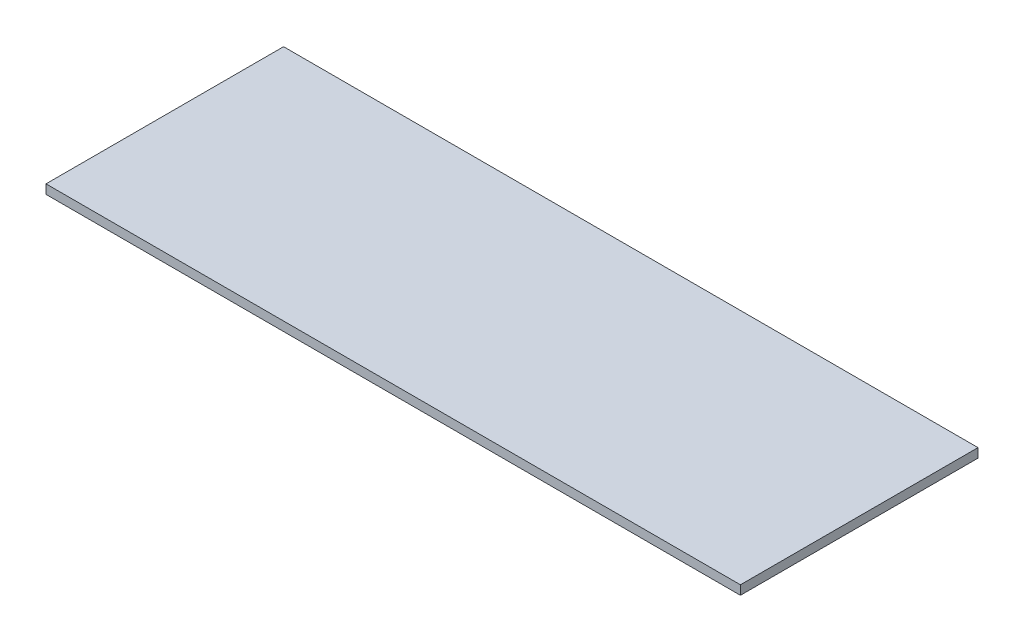
ISO-10303-21;
HEADER;
FILE_DESCRIPTION(('STEP AP214'),'2;1');
FILE_NAME('part.step','',(''),(''),'','','');
FILE_SCHEMA(('AUTOMOTIVE_DESIGN { 1 0 10303 214 1 1 1 1 }'));
ENDSEC;
DATA;
#1=APPLICATION_CONTEXT('core data for automotive mechanical design processes');
#2=APPLICATION_PROTOCOL_DEFINITION('international standard','automotive_design',2000,#1);
#3=PRODUCT_CONTEXT('',#1,'mechanical');
#4=PRODUCT('Part','Part','',(#3));
#5=PRODUCT_RELATED_PRODUCT_CATEGORY('part','',(#4));
#6=PRODUCT_DEFINITION_FORMATION('','',#4);
#7=PRODUCT_DEFINITION_CONTEXT('part definition',#1,'design');
#8=PRODUCT_DEFINITION('design','',#6,#7);
#9=PRODUCT_DEFINITION_SHAPE('','',#8);
#10=(LENGTH_UNIT() NAMED_UNIT(*) SI_UNIT(.MILLI.,.METRE.));
#11=(NAMED_UNIT(*) PLANE_ANGLE_UNIT() SI_UNIT($,.RADIAN.));
#12=(NAMED_UNIT(*) SI_UNIT($,.STERADIAN.) SOLID_ANGLE_UNIT());
#13=UNCERTAINTY_MEASURE_WITH_UNIT(LENGTH_MEASURE(1.E-05),#10,'distance_accuracy_value','');
#14=(GEOMETRIC_REPRESENTATION_CONTEXT(3) GLOBAL_UNCERTAINTY_ASSIGNED_CONTEXT((#13)) GLOBAL_UNIT_ASSIGNED_CONTEXT((#10,
#11,#12)) REPRESENTATION_CONTEXT('',''));
#15=CARTESIAN_POINT('',(0.,0.,0.));
#16=DIRECTION('',(0.,0.,1.));
#17=DIRECTION('',(1.,0.,0.));
#18=AXIS2_PLACEMENT_3D('',#15,#16,#17);
#19=CARTESIAN_POINT('',(-39.1198428290766,1.,-16.3497053045187));
#20=DIRECTION('',(1.,0.,0.));
#21=DIRECTION('',(0.,0.,-1.));
#22=AXIS2_PLACEMENT_3D('',#19,#20,#21);
#23=PLANE('',#22);
#24=DIRECTION('',(0.,0.,1.));
#25=VECTOR('',#24,1.);
#26=CARTESIAN_POINT('',(-39.1198428290766,0.,-16.3497053045187));
#27=LINE('',#26,#25);
#28=CARTESIAN_POINT('',(-39.1198428290766,0.,-16.3497053045187));
#29=VERTEX_POINT('',#28);
#30=CARTESIAN_POINT('',(-39.1198428290766,0.,9.65029469548134));
#31=VERTEX_POINT('',#30);
#32=EDGE_CURVE('E95',#29,#31,#27,.T.);
#33=ORIENTED_EDGE('',*,*,#32,.T.);
#34=DIRECTION('',(0.,-1.,0.));
#35=VECTOR('',#34,1.);
#36=CARTESIAN_POINT('',(-39.1198428290766,1.,9.65029469548134));
#37=LINE('',#36,#35);
#38=CARTESIAN_POINT('',(-39.1198428290766,1.,9.65029469548134));
#39=VERTEX_POINT('',#38);
#40=EDGE_CURVE('E11',#39,#31,#37,.T.);
#41=ORIENTED_EDGE('',*,*,#40,.F.);
#42=DIRECTION('',(0.,0.,1.));
#43=VECTOR('',#42,1.);
#44=CARTESIAN_POINT('',(-39.1198428290766,1.,-16.3497053045187));
#45=LINE('',#44,#43);
#46=CARTESIAN_POINT('',(-39.1198428290766,1.,-16.3497053045187));
#47=VERTEX_POINT('',#46);
#48=EDGE_CURVE('E83',#47,#39,#45,.T.);
#49=ORIENTED_EDGE('',*,*,#48,.F.);
#50=DIRECTION('',(0.,-1.,0.));
#51=VECTOR('',#50,1.);
#52=CARTESIAN_POINT('',(-39.1198428290766,1.,-16.3497053045187));
#53=LINE('',#52,#51);
#54=EDGE_CURVE('E91',#47,#29,#53,.T.);
#55=ORIENTED_EDGE('',*,*,#54,.T.);
#56=EDGE_LOOP('',(#33,#41,#49,#55));
#57=FACE_BOUND('',#56,.T.);
#58=ADVANCED_FACE('F32',(#57),#23,.F.);
#59=CARTESIAN_POINT('',(-39.1198428290766,1.,9.65029469548134));
#60=DIRECTION('',(0.,0.,-1.));
#61=DIRECTION('',(-1.,0.,0.));
#62=AXIS2_PLACEMENT_3D('',#59,#60,#61);
#63=PLANE('',#62);
#64=DIRECTION('',(1.,0.,0.));
#65=VECTOR('',#64,1.);
#66=CARTESIAN_POINT('',(-39.1198428290766,0.,9.65029469548134));
#67=LINE('',#66,#65);
#68=CARTESIAN_POINT('',(36.8801571709234,0.,9.65029469548134));
#69=VERTEX_POINT('',#68);
#70=EDGE_CURVE('E87',#31,#69,#67,.T.);
#71=ORIENTED_EDGE('',*,*,#70,.T.);
#72=DIRECTION('',(0.,-1.,0.));
#73=VECTOR('',#72,1.);
#74=CARTESIAN_POINT('',(36.8801571709234,1.,9.65029469548134));
#75=LINE('',#74,#73);
#76=CARTESIAN_POINT('',(36.8801571709234,1.,9.65029469548134));
#77=VERTEX_POINT('',#76);
#78=EDGE_CURVE('E40',#77,#69,#75,.T.);
#79=ORIENTED_EDGE('',*,*,#78,.F.);
#80=DIRECTION('',(1.,0.,0.));
#81=VECTOR('',#80,1.);
#82=CARTESIAN_POINT('',(-39.1198428290766,1.,9.65029469548134));
#83=LINE('',#82,#81);
#84=EDGE_CURVE('E78',#39,#77,#83,.T.);
#85=ORIENTED_EDGE('',*,*,#84,.F.);
#86=ORIENTED_EDGE('',*,*,#40,.T.);
#87=EDGE_LOOP('',(#71,#79,#85,#86));
#88=FACE_BOUND('',#87,.T.);
#89=ADVANCED_FACE('F86',(#88),#63,.F.);
#90=CARTESIAN_POINT('',(36.8801571709234,1.,-16.3497053045187));
#91=DIRECTION('',(-1.,0.,0.));
#92=DIRECTION('',(0.,0.,1.));
#93=AXIS2_PLACEMENT_3D('',#90,#91,#92);
#94=PLANE('',#93);
#95=DIRECTION('',(0.,0.,-1.));
#96=VECTOR('',#95,1.);
#97=CARTESIAN_POINT('',(36.8801571709234,0.,-16.3497053045187));
#98=LINE('',#97,#96);
#99=CARTESIAN_POINT('',(36.8801571709234,0.,-16.3497053045187));
#100=VERTEX_POINT('',#99);
#101=EDGE_CURVE('E65',#69,#100,#98,.T.);
#102=ORIENTED_EDGE('',*,*,#101,.T.);
#103=DIRECTION('',(0.,-1.,0.));
#104=VECTOR('',#103,1.);
#105=CARTESIAN_POINT('',(36.8801571709234,1.,-16.3497053045187));
#106=LINE('',#105,#104);
#107=CARTESIAN_POINT('',(36.8801571709234,1.,-16.3497053045187));
#108=VERTEX_POINT('',#107);
#109=EDGE_CURVE('E88',#108,#100,#106,.T.);
#110=ORIENTED_EDGE('',*,*,#109,.F.);
#111=DIRECTION('',(0.,0.,-1.));
#112=VECTOR('',#111,1.);
#113=CARTESIAN_POINT('',(36.8801571709234,1.,-16.3497053045187));
#114=LINE('',#113,#112);
#115=EDGE_CURVE('E81',#77,#108,#114,.T.);
#116=ORIENTED_EDGE('',*,*,#115,.F.);
#117=ORIENTED_EDGE('',*,*,#78,.T.);
#118=EDGE_LOOP('',(#102,#110,#116,#117));
#119=FACE_BOUND('',#118,.T.);
#120=ADVANCED_FACE('F89',(#119),#94,.F.);
#121=CARTESIAN_POINT('',(-39.1198428290766,1.,-16.3497053045187));
#122=DIRECTION('',(0.,0.,1.));
#123=DIRECTION('',(1.,0.,0.));
#124=AXIS2_PLACEMENT_3D('',#121,#122,#123);
#125=PLANE('',#124);
#126=DIRECTION('',(-1.,0.,0.));
#127=VECTOR('',#126,1.);
#128=CARTESIAN_POINT('',(-39.1198428290766,0.,-16.3497053045187));
#129=LINE('',#128,#127);
#130=EDGE_CURVE('E71',#100,#29,#129,.T.);
#131=ORIENTED_EDGE('',*,*,#130,.T.);
#132=ORIENTED_EDGE('',*,*,#54,.F.);
#133=DIRECTION('',(-1.,0.,0.));
#134=VECTOR('',#133,1.);
#135=CARTESIAN_POINT('',(-39.1198428290766,1.,-16.3497053045187));
#136=LINE('',#135,#134);
#137=EDGE_CURVE('E48',#108,#47,#136,.T.);
#138=ORIENTED_EDGE('',*,*,#137,.F.);
#139=ORIENTED_EDGE('',*,*,#109,.T.);
#140=EDGE_LOOP('',(#131,#132,#138,#139));
#141=FACE_BOUND('',#140,.T.);
#142=ADVANCED_FACE('F102',(#141),#125,.F.);
#143=CARTESIAN_POINT('',(0.,1.,0.));
#144=DIRECTION('',(0.,1.,0.));
#145=DIRECTION('',(0.,0.,1.));
#146=AXIS2_PLACEMENT_3D('',#143,#144,#145);
#147=PLANE('',#146);
#148=ORIENTED_EDGE('',*,*,#48,.T.);
#149=ORIENTED_EDGE('',*,*,#84,.T.);
#150=ORIENTED_EDGE('',*,*,#115,.T.);
#151=ORIENTED_EDGE('',*,*,#137,.T.);
#152=EDGE_LOOP('',(#148,#149,#150,#151));
#153=FACE_BOUND('',#152,.T.);
#154=ADVANCED_FACE('F79',(#153),#147,.T.);
#155=CARTESIAN_POINT('',(0.,0.,0.));
#156=DIRECTION('',(0.,1.,0.));
#157=DIRECTION('',(0.,0.,1.));
#158=AXIS2_PLACEMENT_3D('',#155,#156,#157);
#159=PLANE('',#158);
#160=ORIENTED_EDGE('',*,*,#32,.F.);
#161=ORIENTED_EDGE('',*,*,#130,.F.);
#162=ORIENTED_EDGE('',*,*,#101,.F.);
#163=ORIENTED_EDGE('',*,*,#70,.F.);
#164=EDGE_LOOP('',(#160,#161,#162,#163));
#165=FACE_BOUND('',#164,.T.);
#166=ADVANCED_FACE('F105',(#165),#159,.F.);
#167=CLOSED_SHELL('',(#58,#89,#120,#142,#154,#166));
#168=MANIFOLD_SOLID_BREP('B2',#167);
#169=ADVANCED_BREP_SHAPE_REPRESENTATION('',(#18,#168),#14);
#170=SHAPE_DEFINITION_REPRESENTATION(#9,#169);
ENDSEC;
END-ISO-10303-21;
